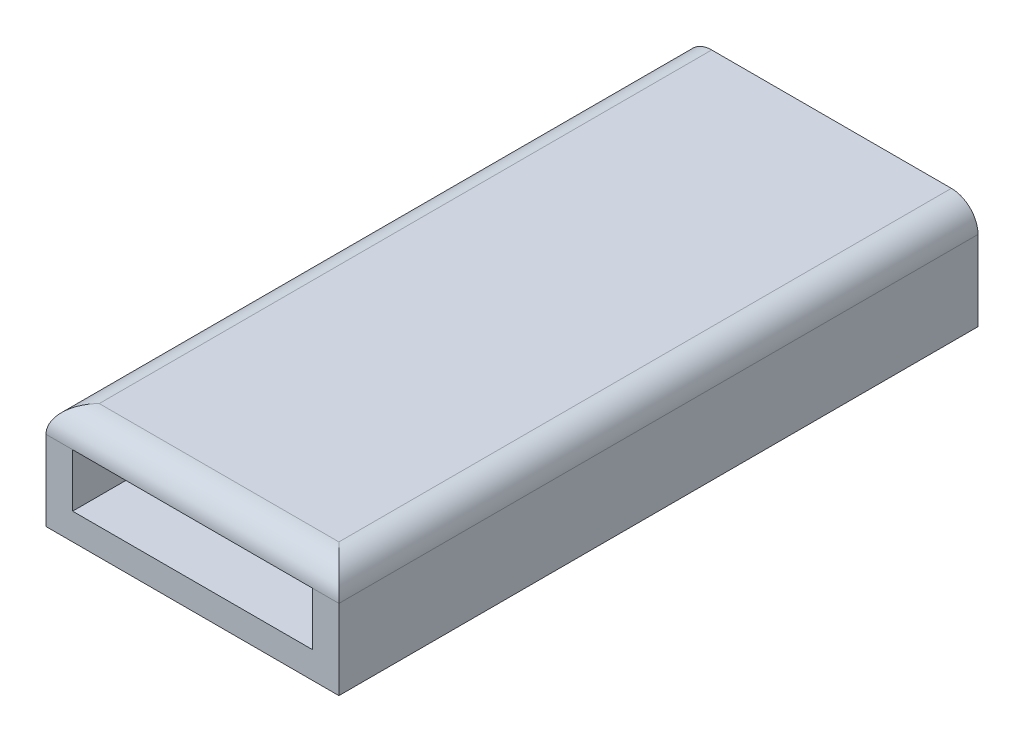
ISO-10303-21;
HEADER;
FILE_DESCRIPTION(('STEP AP214'),'2;1');
FILE_NAME('part.step','',(''),(''),'','','');
FILE_SCHEMA(('AUTOMOTIVE_DESIGN { 1 0 10303 214 1 1 1 1 }'));
ENDSEC;
DATA;
#1=APPLICATION_CONTEXT('core data for automotive mechanical design processes');
#2=APPLICATION_PROTOCOL_DEFINITION('international standard','automotive_design',2000,#1);
#3=PRODUCT_CONTEXT('',#1,'mechanical');
#4=PRODUCT('Part','Part','',(#3));
#5=PRODUCT_RELATED_PRODUCT_CATEGORY('part','',(#4));
#6=PRODUCT_DEFINITION_FORMATION('','',#4);
#7=PRODUCT_DEFINITION_CONTEXT('part definition',#1,'design');
#8=PRODUCT_DEFINITION('design','',#6,#7);
#9=PRODUCT_DEFINITION_SHAPE('','',#8);
#10=(LENGTH_UNIT() NAMED_UNIT(*) SI_UNIT(.MILLI.,.METRE.));
#11=(NAMED_UNIT(*) PLANE_ANGLE_UNIT() SI_UNIT($,.RADIAN.));
#12=(NAMED_UNIT(*) SI_UNIT($,.STERADIAN.) SOLID_ANGLE_UNIT());
#13=UNCERTAINTY_MEASURE_WITH_UNIT(LENGTH_MEASURE(1.E-05),#10,'distance_accuracy_value','');
#14=(GEOMETRIC_REPRESENTATION_CONTEXT(3) GLOBAL_UNCERTAINTY_ASSIGNED_CONTEXT((#13)) GLOBAL_UNIT_ASSIGNED_CONTEXT((#10,
#11,#12)) REPRESENTATION_CONTEXT('',''));
#15=CARTESIAN_POINT('',(0.,0.,0.));
#16=DIRECTION('',(0.,0.,1.));
#17=DIRECTION('',(1.,0.,0.));
#18=AXIS2_PLACEMENT_3D('',#15,#16,#17);
#19=CARTESIAN_POINT('',(17.4625,-6.35,76.2));
#20=DIRECTION('',(-1.,0.,0.));
#21=DIRECTION('',(0.,0.,1.));
#22=AXIS2_PLACEMENT_3D('',#19,#20,#21);
#23=PLANE('',#22);
#24=DIRECTION('',(0.,1.,0.));
#25=VECTOR('',#24,1.);
#26=CARTESIAN_POINT('',(17.4625,-6.35,0.));
#27=LINE('',#26,#25);
#28=CARTESIAN_POINT('',(17.4625,-6.35,0.));
#29=VERTEX_POINT('',#28);
#30=CARTESIAN_POINT('',(17.4625,3.175,0.));
#31=VERTEX_POINT('',#30);
#32=EDGE_CURVE('E171',#29,#31,#27,.T.);
#33=ORIENTED_EDGE('',*,*,#32,.T.);
#34=DIRECTION('',(0.,0.,-1.));
#35=VECTOR('',#34,1.);
#36=CARTESIAN_POINT('',(17.4625,3.175,76.2));
#37=LINE('',#36,#35);
#38=CARTESIAN_POINT('',(17.4625,3.175,76.2));
#39=VERTEX_POINT('',#38);
#40=EDGE_CURVE('E51',#31,#39,#37,.F.);
#41=ORIENTED_EDGE('',*,*,#40,.T.);
#42=DIRECTION('',(0.,1.,0.));
#43=VECTOR('',#42,1.);
#44=CARTESIAN_POINT('',(17.4625,-6.35,76.2));
#45=LINE('',#44,#43);
#46=CARTESIAN_POINT('',(17.4625,-6.35,76.2));
#47=VERTEX_POINT('',#46);
#48=EDGE_CURVE('E177',#47,#39,#45,.T.);
#49=ORIENTED_EDGE('',*,*,#48,.F.);
#50=DIRECTION('',(0.,0.,-1.));
#51=VECTOR('',#50,1.);
#52=CARTESIAN_POINT('',(17.4625,-6.35,76.2));
#53=LINE('',#52,#51);
#54=EDGE_CURVE('E188',#47,#29,#53,.T.);
#55=ORIENTED_EDGE('',*,*,#54,.T.);
#56=EDGE_LOOP('',(#33,#41,#49,#55));
#57=FACE_BOUND('',#56,.T.);
#58=ADVANCED_FACE('F41',(#57),#23,.F.);
#59=CARTESIAN_POINT('',(-17.4625,6.35,76.2));
#60=DIRECTION('',(0.,-1.,0.));
#61=DIRECTION('',(0.,0.,-1.));
#62=AXIS2_PLACEMENT_3D('',#59,#60,#61);
#63=PLANE('',#62);
#64=DIRECTION('',(-1.,0.,0.));
#65=VECTOR('',#64,1.);
#66=CARTESIAN_POINT('',(-17.4625,6.35,73.025));
#67=LINE('',#66,#65);
#68=CARTESIAN_POINT('',(-14.2875,6.35,73.025));
#69=VERTEX_POINT('',#68);
#70=CARTESIAN_POINT('',(14.2875,6.35,73.025));
#71=VERTEX_POINT('',#70);
#72=EDGE_CURVE('E217',#69,#71,#67,.F.);
#73=ORIENTED_EDGE('',*,*,#72,.T.);
#74=DIRECTION('',(0.,0.,-1.));
#75=VECTOR('',#74,1.);
#76=CARTESIAN_POINT('',(14.2875,6.35,76.2));
#77=LINE('',#76,#75);
#78=CARTESIAN_POINT('',(14.2875,6.35,0.));
#79=VERTEX_POINT('',#78);
#80=EDGE_CURVE('E220',#71,#79,#77,.T.);
#81=ORIENTED_EDGE('',*,*,#80,.T.);
#82=DIRECTION('',(-1.,0.,0.));
#83=VECTOR('',#82,1.);
#84=CARTESIAN_POINT('',(-17.4625,6.35,0.));
#85=LINE('',#84,#83);
#86=CARTESIAN_POINT('',(-14.2875,6.35,0.));
#87=VERTEX_POINT('',#86);
#88=EDGE_CURVE('E191',#79,#87,#85,.T.);
#89=ORIENTED_EDGE('',*,*,#88,.T.);
#90=DIRECTION('',(0.,0.,-1.));
#91=VECTOR('',#90,1.);
#92=CARTESIAN_POINT('',(-14.2875,6.35,76.2));
#93=LINE('',#92,#91);
#94=EDGE_CURVE('E214',#87,#69,#93,.F.);
#95=ORIENTED_EDGE('',*,*,#94,.T.);
#96=EDGE_LOOP('',(#73,#81,#89,#95));
#97=FACE_BOUND('',#96,.T.);
#98=ADVANCED_FACE('F245',(#97),#63,.F.);
#99=CARTESIAN_POINT('',(-17.4625,-6.35,76.2));
#100=DIRECTION('',(1.,0.,0.));
#101=DIRECTION('',(0.,0.,-1.));
#102=AXIS2_PLACEMENT_3D('',#99,#100,#101);
#103=PLANE('',#102);
#104=DIRECTION('',(0.,-1.,0.));
#105=VECTOR('',#104,1.);
#106=CARTESIAN_POINT('',(-17.4625,-6.35,76.2));
#107=LINE('',#106,#105);
#108=CARTESIAN_POINT('',(-17.4625,3.175,76.2));
#109=VERTEX_POINT('',#108);
#110=CARTESIAN_POINT('',(-17.4625,-6.35,76.2));
#111=VERTEX_POINT('',#110);
#112=EDGE_CURVE('E181',#109,#111,#107,.T.);
#113=ORIENTED_EDGE('',*,*,#112,.F.);
#114=DIRECTION('',(0.,0.,-1.));
#115=VECTOR('',#114,1.);
#116=CARTESIAN_POINT('',(-17.4625,3.175,76.2));
#117=LINE('',#116,#115);
#118=CARTESIAN_POINT('',(-17.4625,3.175,0.));
#119=VERTEX_POINT('',#118);
#120=EDGE_CURVE('E11',#109,#119,#117,.T.);
#121=ORIENTED_EDGE('',*,*,#120,.T.);
#122=DIRECTION('',(0.,-1.,0.));
#123=VECTOR('',#122,1.);
#124=CARTESIAN_POINT('',(-17.4625,-6.35,0.));
#125=LINE('',#124,#123);
#126=CARTESIAN_POINT('',(-17.4625,-6.35,0.));
#127=VERTEX_POINT('',#126);
#128=EDGE_CURVE('E195',#119,#127,#125,.T.);
#129=ORIENTED_EDGE('',*,*,#128,.T.);
#130=DIRECTION('',(0.,0.,-1.));
#131=VECTOR('',#130,1.);
#132=CARTESIAN_POINT('',(-17.4625,-6.35,76.2));
#133=LINE('',#132,#131);
#134=EDGE_CURVE('E203',#111,#127,#133,.T.);
#135=ORIENTED_EDGE('',*,*,#134,.F.);
#136=EDGE_LOOP('',(#113,#121,#129,#135));
#137=FACE_BOUND('',#136,.T.);
#138=ADVANCED_FACE('F264',(#137),#103,.F.);
#139=CARTESIAN_POINT('',(-17.4625,-6.35,76.2));
#140=DIRECTION('',(0.,1.,0.));
#141=DIRECTION('',(0.,0.,1.));
#142=AXIS2_PLACEMENT_3D('',#139,#140,#141);
#143=PLANE('',#142);
#144=DIRECTION('',(1.,0.,0.));
#145=VECTOR('',#144,1.);
#146=CARTESIAN_POINT('',(-17.4625,-6.35,0.));
#147=LINE('',#146,#145);
#148=EDGE_CURVE('E182',#127,#29,#147,.T.);
#149=ORIENTED_EDGE('',*,*,#148,.T.);
#150=ORIENTED_EDGE('',*,*,#54,.F.);
#151=DIRECTION('',(1.,0.,0.));
#152=VECTOR('',#151,1.);
#153=CARTESIAN_POINT('',(-17.4625,-6.35,76.2));
#154=LINE('',#153,#152);
#155=EDGE_CURVE('E185',#111,#47,#154,.T.);
#156=ORIENTED_EDGE('',*,*,#155,.F.);
#157=ORIENTED_EDGE('',*,*,#134,.T.);
#158=EDGE_LOOP('',(#149,#150,#156,#157));
#159=FACE_BOUND('',#158,.T.);
#160=ADVANCED_FACE('F269',(#159),#143,.F.);
#161=CARTESIAN_POINT('',(0.,0.,76.2));
#162=DIRECTION('',(0.,0.,-1.));
#163=DIRECTION('',(-1.,0.,0.));
#164=AXIS2_PLACEMENT_3D('',#161,#162,#163);
#165=PLANE('',#164);
#166=ORIENTED_EDGE('',*,*,#48,.T.);
#167=DIRECTION('',(-1.,0.,0.));
#168=VECTOR('',#167,1.);
#169=CARTESIAN_POINT('',(0.,3.175,76.2));
#170=LINE('',#169,#168);
#171=CARTESIAN_POINT('',(14.2875,3.175,76.2));
#172=VERTEX_POINT('',#171);
#173=EDGE_CURVE('E210',#39,#172,#170,.T.);
#174=ORIENTED_EDGE('',*,*,#173,.T.);
#175=DIRECTION('',(0.,1.,0.));
#176=VECTOR('',#175,1.);
#177=CARTESIAN_POINT('',(14.2875,-3.175,76.2));
#178=LINE('',#177,#176);
#179=CARTESIAN_POINT('',(14.2875,-3.175,76.2));
#180=VERTEX_POINT('',#179);
#181=EDGE_CURVE('E130',#180,#172,#178,.T.);
#182=ORIENTED_EDGE('',*,*,#181,.F.);
#183=DIRECTION('',(1.,0.,0.));
#184=VECTOR('',#183,1.);
#185=CARTESIAN_POINT('',(-14.2875,-3.175,76.2));
#186=LINE('',#185,#184);
#187=CARTESIAN_POINT('',(-14.2875,-3.175,76.2));
#188=VERTEX_POINT('',#187);
#189=EDGE_CURVE('E149',#188,#180,#186,.T.);
#190=ORIENTED_EDGE('',*,*,#189,.F.);
#191=DIRECTION('',(0.,-1.,0.));
#192=VECTOR('',#191,1.);
#193=CARTESIAN_POINT('',(-14.2875,-3.175,76.2));
#194=LINE('',#193,#192);
#195=CARTESIAN_POINT('',(-14.2875,3.175,76.2));
#196=VERTEX_POINT('',#195);
#197=EDGE_CURVE('E153',#196,#188,#194,.T.);
#198=ORIENTED_EDGE('',*,*,#197,.F.);
#199=DIRECTION('',(-1.,0.,0.));
#200=VECTOR('',#199,1.);
#201=CARTESIAN_POINT('',(0.,3.175,76.2));
#202=LINE('',#201,#200);
#203=EDGE_CURVE('E207',#196,#109,#202,.T.);
#204=ORIENTED_EDGE('',*,*,#203,.T.);
#205=ORIENTED_EDGE('',*,*,#112,.T.);
#206=ORIENTED_EDGE('',*,*,#155,.T.);
#207=EDGE_LOOP('',(#166,#174,#182,#190,#198,#204,#205,#206));
#208=FACE_BOUND('',#207,.T.);
#209=ADVANCED_FACE('F272',(#208),#165,.F.);
#210=CARTESIAN_POINT('',(0.,0.,0.));
#211=DIRECTION('',(0.,0.,-1.));
#212=DIRECTION('',(-1.,0.,0.));
#213=AXIS2_PLACEMENT_3D('',#210,#211,#212);
#214=PLANE('',#213);
#215=ORIENTED_EDGE('',*,*,#88,.F.);
#216=CARTESIAN_POINT('',(14.2875,3.175,0.));
#217=DIRECTION('',(0.,0.,-1.));
#218=DIRECTION('',(-1.,0.,0.));
#219=AXIS2_PLACEMENT_3D('',#216,#217,#218);
#220=CIRCLE('',#219,3.175);
#221=EDGE_CURVE('E65',#79,#31,#220,.T.);
#222=ORIENTED_EDGE('',*,*,#221,.T.);
#223=ORIENTED_EDGE('',*,*,#32,.F.);
#224=ORIENTED_EDGE('',*,*,#148,.F.);
#225=ORIENTED_EDGE('',*,*,#128,.F.);
#226=CARTESIAN_POINT('',(-14.2875,3.175,0.));
#227=DIRECTION('',(0.,0.,-1.));
#228=DIRECTION('',(-1.,0.,0.));
#229=AXIS2_PLACEMENT_3D('',#226,#227,#228);
#230=CIRCLE('',#229,3.175);
#231=EDGE_CURVE('E223',#119,#87,#230,.T.);
#232=ORIENTED_EDGE('',*,*,#231,.T.);
#233=EDGE_LOOP('',(#215,#222,#223,#224,#225,#232));
#234=FACE_BOUND('',#233,.T.);
#235=ADVANCED_FACE('F247',(#234),#214,.T.);
#236=CARTESIAN_POINT('',(14.2875,-3.175,1.27000000000001));
#237=DIRECTION('',(1.,0.,0.));
#238=DIRECTION('',(0.,0.,-1.));
#239=AXIS2_PLACEMENT_3D('',#236,#237,#238);
#240=PLANE('',#239);
#241=ORIENTED_EDGE('',*,*,#181,.T.);
#242=DIRECTION('',(0.,0.,1.));
#243=VECTOR('',#242,1.);
#244=CARTESIAN_POINT('',(14.2875,3.175,1.27000000000001));
#245=LINE('',#244,#243);
#246=CARTESIAN_POINT('',(14.2875,3.175,1.27000000000001));
#247=VERTEX_POINT('',#246);
#248=EDGE_CURVE('E123',#247,#172,#245,.T.);
#249=ORIENTED_EDGE('',*,*,#248,.F.);
#250=DIRECTION('',(0.,1.,0.));
#251=VECTOR('',#250,1.);
#252=CARTESIAN_POINT('',(14.2875,-3.175,1.27000000000001));
#253=LINE('',#252,#251);
#254=CARTESIAN_POINT('',(14.2875,-3.175,1.27000000000001));
#255=VERTEX_POINT('',#254);
#256=EDGE_CURVE('E127',#255,#247,#253,.T.);
#257=ORIENTED_EDGE('',*,*,#256,.F.);
#258=DIRECTION('',(0.,0.,1.));
#259=VECTOR('',#258,1.);
#260=CARTESIAN_POINT('',(14.2875,-3.175,1.27000000000001));
#261=LINE('',#260,#259);
#262=EDGE_CURVE('E168',#255,#180,#261,.T.);
#263=ORIENTED_EDGE('',*,*,#262,.T.);
#264=EDGE_LOOP('',(#241,#249,#257,#263));
#265=FACE_BOUND('',#264,.T.);
#266=ADVANCED_FACE('F125',(#265),#240,.F.);
#267=CARTESIAN_POINT('',(-14.2875,-3.175,1.27000000000001));
#268=DIRECTION('',(0.,-1.,0.));
#269=DIRECTION('',(0.,0.,-1.));
#270=AXIS2_PLACEMENT_3D('',#267,#268,#269);
#271=PLANE('',#270);
#272=ORIENTED_EDGE('',*,*,#189,.T.);
#273=ORIENTED_EDGE('',*,*,#262,.F.);
#274=DIRECTION('',(1.,0.,0.));
#275=VECTOR('',#274,1.);
#276=CARTESIAN_POINT('',(-14.2875,-3.175,1.27000000000001));
#277=LINE('',#276,#275);
#278=CARTESIAN_POINT('',(-14.2875,-3.175,1.27000000000001));
#279=VERTEX_POINT('',#278);
#280=EDGE_CURVE('E135',#279,#255,#277,.T.);
#281=ORIENTED_EDGE('',*,*,#280,.F.);
#282=DIRECTION('',(0.,0.,1.));
#283=VECTOR('',#282,1.);
#284=CARTESIAN_POINT('',(-14.2875,-3.175,1.27000000000001));
#285=LINE('',#284,#283);
#286=EDGE_CURVE('E172',#279,#188,#285,.T.);
#287=ORIENTED_EDGE('',*,*,#286,.T.);
#288=EDGE_LOOP('',(#272,#273,#281,#287));
#289=FACE_BOUND('',#288,.T.);
#290=ADVANCED_FACE('F281',(#289),#271,.F.);
#291=CARTESIAN_POINT('',(-14.2875,-3.175,1.27000000000001));
#292=DIRECTION('',(-1.,0.,0.));
#293=DIRECTION('',(0.,0.,1.));
#294=AXIS2_PLACEMENT_3D('',#291,#292,#293);
#295=PLANE('',#294);
#296=ORIENTED_EDGE('',*,*,#197,.T.);
#297=ORIENTED_EDGE('',*,*,#286,.F.);
#298=DIRECTION('',(0.,-1.,0.));
#299=VECTOR('',#298,1.);
#300=CARTESIAN_POINT('',(-14.2875,-3.175,1.27000000000001));
#301=LINE('',#300,#299);
#302=CARTESIAN_POINT('',(-14.2875,3.175,1.27000000000001));
#303=VERTEX_POINT('',#302);
#304=EDGE_CURVE('E144',#303,#279,#301,.T.);
#305=ORIENTED_EDGE('',*,*,#304,.F.);
#306=DIRECTION('',(0.,0.,1.));
#307=VECTOR('',#306,1.);
#308=CARTESIAN_POINT('',(-14.2875,3.175,1.27000000000001));
#309=LINE('',#308,#307);
#310=EDGE_CURVE('E134',#303,#196,#309,.T.);
#311=ORIENTED_EDGE('',*,*,#310,.T.);
#312=EDGE_LOOP('',(#296,#297,#305,#311));
#313=FACE_BOUND('',#312,.T.);
#314=ADVANCED_FACE('F284',(#313),#295,.F.);
#315=CARTESIAN_POINT('',(-14.2875,3.175,1.27000000000001));
#316=DIRECTION('',(0.,1.,0.));
#317=DIRECTION('',(0.,0.,1.));
#318=AXIS2_PLACEMENT_3D('',#315,#316,#317);
#319=PLANE('',#318);
#320=DIRECTION('',(-1.,0.,0.));
#321=VECTOR('',#320,1.);
#322=CARTESIAN_POINT('',(-14.2875,3.175,76.2));
#323=LINE('',#322,#321);
#324=EDGE_CURVE('E162',#172,#196,#323,.T.);
#325=ORIENTED_EDGE('',*,*,#324,.T.);
#326=ORIENTED_EDGE('',*,*,#310,.F.);
#327=DIRECTION('',(-1.,0.,0.));
#328=VECTOR('',#327,1.);
#329=CARTESIAN_POINT('',(-14.2875,3.175,1.27000000000001));
#330=LINE('',#329,#328);
#331=EDGE_CURVE('E138',#247,#303,#330,.T.);
#332=ORIENTED_EDGE('',*,*,#331,.F.);
#333=ORIENTED_EDGE('',*,*,#248,.T.);
#334=EDGE_LOOP('',(#325,#326,#332,#333));
#335=FACE_BOUND('',#334,.T.);
#336=ADVANCED_FACE('F139',(#335),#319,.F.);
#337=CARTESIAN_POINT('',(0.,0.,1.27000000000001));
#338=DIRECTION('',(0.,0.,-1.));
#339=DIRECTION('',(-1.,0.,0.));
#340=AXIS2_PLACEMENT_3D('',#337,#338,#339);
#341=PLANE('',#340);
#342=ORIENTED_EDGE('',*,*,#256,.T.);
#343=ORIENTED_EDGE('',*,*,#331,.T.);
#344=ORIENTED_EDGE('',*,*,#304,.T.);
#345=ORIENTED_EDGE('',*,*,#280,.T.);
#346=EDGE_LOOP('',(#342,#343,#344,#345));
#347=FACE_BOUND('',#346,.T.);
#348=ADVANCED_FACE('F146',(#347),#341,.F.);
#349=CARTESIAN_POINT('',(14.2875,3.175,76.2));
#350=DIRECTION('',(0.,0.,-1.));
#351=DIRECTION('',(-1.,0.,0.));
#352=AXIS2_PLACEMENT_3D('',#349,#350,#351);
#353=CYLINDRICAL_SURFACE('',#352,3.175);
#354=ORIENTED_EDGE('',*,*,#221,.F.);
#355=ORIENTED_EDGE('',*,*,#80,.F.);
#356=CARTESIAN_POINT('',(14.2875,3.175,73.025));
#357=DIRECTION('',(0.707106781186547,0.,-0.707106781186547));
#358=DIRECTION('',(-0.707106781186547,0.,-0.707106781186547));
#359=AXIS2_PLACEMENT_3D('',#356,#357,#358);
#360=ELLIPSE('',#359,4.49012806053458,3.175);
#361=EDGE_CURVE('E45',#39,#71,#360,.F.);
#362=ORIENTED_EDGE('',*,*,#361,.F.);
#363=ORIENTED_EDGE('',*,*,#40,.F.);
#364=EDGE_LOOP('',(#354,#355,#362,#363));
#365=FACE_BOUND('',#364,.T.);
#366=ADVANCED_FACE('F43',(#365),#353,.T.);
#367=CARTESIAN_POINT('',(-14.2875,3.175,76.2));
#368=DIRECTION('',(0.,0.,-1.));
#369=DIRECTION('',(-1.,0.,0.));
#370=AXIS2_PLACEMENT_3D('',#367,#368,#369);
#371=CYLINDRICAL_SURFACE('',#370,3.175);
#372=ORIENTED_EDGE('',*,*,#231,.F.);
#373=ORIENTED_EDGE('',*,*,#120,.F.);
#374=CARTESIAN_POINT('',(-14.2875,3.175,73.025));
#375=DIRECTION('',(-0.707106781186547,0.,-0.707106781186547));
#376=DIRECTION('',(0.707106781186547,0.,-0.707106781186547));
#377=AXIS2_PLACEMENT_3D('',#374,#375,#376);
#378=ELLIPSE('',#377,4.49012806053458,3.175);
#379=EDGE_CURVE('E229',#69,#109,#378,.F.);
#380=ORIENTED_EDGE('',*,*,#379,.F.);
#381=ORIENTED_EDGE('',*,*,#94,.F.);
#382=EDGE_LOOP('',(#372,#373,#380,#381));
#383=FACE_BOUND('',#382,.T.);
#384=ADVANCED_FACE('F251',(#383),#371,.T.);
#385=CARTESIAN_POINT('',(0.,3.175,73.025));
#386=DIRECTION('',(-1.,0.,0.));
#387=DIRECTION('',(0.,0.,1.));
#388=AXIS2_PLACEMENT_3D('',#385,#386,#387);
#389=CYLINDRICAL_SURFACE('',#388,3.175);
#390=ORIENTED_EDGE('',*,*,#361,.T.);
#391=ORIENTED_EDGE('',*,*,#72,.F.);
#392=ORIENTED_EDGE('',*,*,#379,.T.);
#393=ORIENTED_EDGE('',*,*,#203,.F.);
#394=ORIENTED_EDGE('',*,*,#324,.F.);
#395=ORIENTED_EDGE('',*,*,#173,.F.);
#396=EDGE_LOOP('',(#390,#391,#392,#393,#394,#395));
#397=FACE_BOUND('',#396,.T.);
#398=ADVANCED_FACE('F240',(#397),#389,.T.);
#399=CLOSED_SHELL('',(#58,#98,#138,#160,#209,#235,#266,#290,#314,#336,#348,#366,#384,#398));
#400=MANIFOLD_SOLID_BREP('B2',#399);
#401=ADVANCED_BREP_SHAPE_REPRESENTATION('',(#18,#400),#14);
#402=SHAPE_DEFINITION_REPRESENTATION(#9,#401);
ENDSEC;
END-ISO-10303-21;
